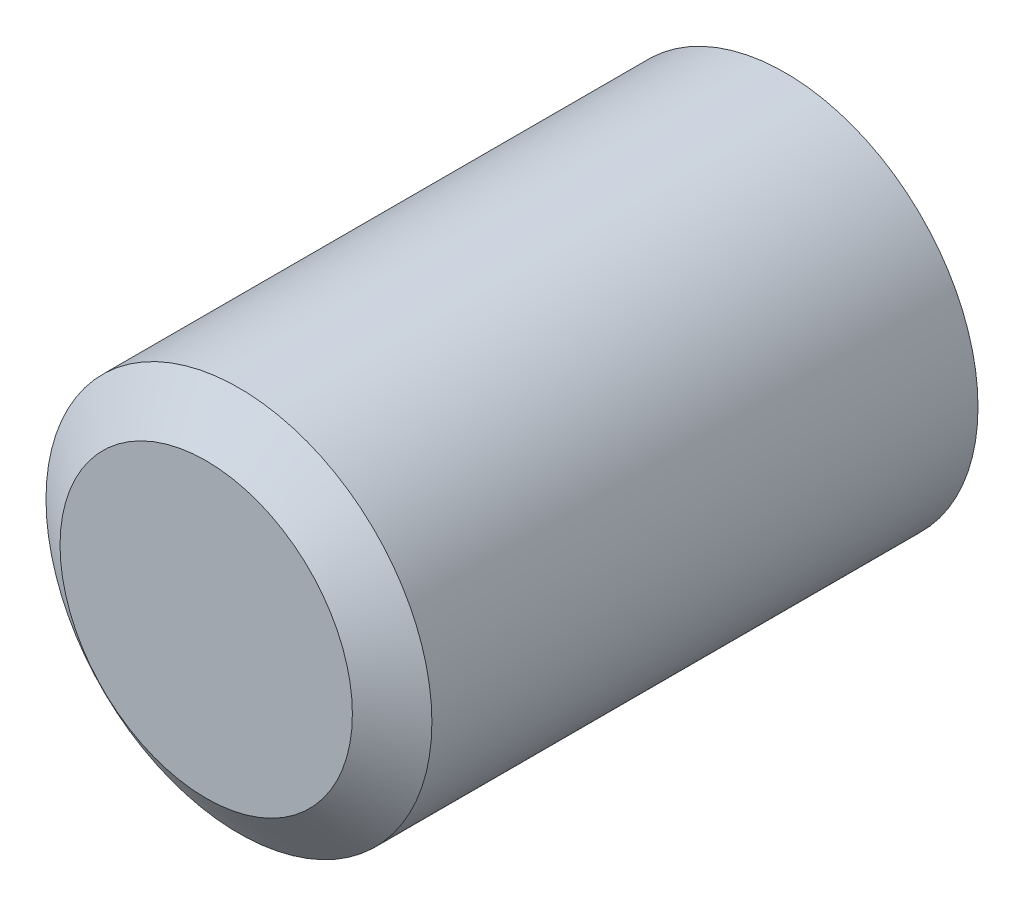
ISO-10303-21;
HEADER;
FILE_DESCRIPTION(('STEP AP214'),'2;1');
FILE_NAME('part.step','',(''),(''),'','','');
FILE_SCHEMA(('AUTOMOTIVE_DESIGN { 1 0 10303 214 1 1 1 1 }'));
ENDSEC;
DATA;
#1=APPLICATION_CONTEXT('core data for automotive mechanical design processes');
#2=APPLICATION_PROTOCOL_DEFINITION('international standard','automotive_design',2000,#1);
#3=PRODUCT_CONTEXT('',#1,'mechanical');
#4=PRODUCT('Part','Part','',(#3));
#5=PRODUCT_RELATED_PRODUCT_CATEGORY('part','',(#4));
#6=PRODUCT_DEFINITION_FORMATION('','',#4);
#7=PRODUCT_DEFINITION_CONTEXT('part definition',#1,'design');
#8=PRODUCT_DEFINITION('design','',#6,#7);
#9=PRODUCT_DEFINITION_SHAPE('','',#8);
#10=(LENGTH_UNIT() NAMED_UNIT(*) SI_UNIT(.MILLI.,.METRE.));
#11=(NAMED_UNIT(*) PLANE_ANGLE_UNIT() SI_UNIT($,.RADIAN.));
#12=(NAMED_UNIT(*) SI_UNIT($,.STERADIAN.) SOLID_ANGLE_UNIT());
#13=UNCERTAINTY_MEASURE_WITH_UNIT(LENGTH_MEASURE(1.E-05),#10,'distance_accuracy_value','');
#14=(GEOMETRIC_REPRESENTATION_CONTEXT(3) GLOBAL_UNCERTAINTY_ASSIGNED_CONTEXT((#13)) GLOBAL_UNIT_ASSIGNED_CONTEXT((#10,
#11,#12)) REPRESENTATION_CONTEXT('',''));
#15=CARTESIAN_POINT('',(0.,0.,0.));
#16=DIRECTION('',(0.,0.,1.));
#17=DIRECTION('',(1.,0.,0.));
#18=AXIS2_PLACEMENT_3D('',#15,#16,#17);
#19=CARTESIAN_POINT('',(0.,0.,9.525));
#20=DIRECTION('',(0.,0.,-1.));
#21=DIRECTION('',(-1.,0.,0.));
#22=AXIS2_PLACEMENT_3D('',#19,#20,#21);
#23=CYLINDRICAL_SURFACE('',#22,3.175);
#24=CARTESIAN_POINT('',(0.,0.,8.98615127117986));
#25=DIRECTION('',(0.,0.,-1.));
#26=DIRECTION('',(-1.,0.,0.));
#27=AXIS2_PLACEMENT_3D('',#24,#25,#26);
#28=CIRCLE('',#27,3.175);
#29=CARTESIAN_POINT('',(-3.175,0.,8.98615127117986));
#30=VERTEX_POINT('',#29);
#31=EDGE_CURVE('E49',#30,#30,#28,.T.);
#32=CARTESIAN_POINT('',(0.,0.,0.));
#33=DIRECTION('',(0.,0.,1.));
#34=DIRECTION('',(1.,0.,0.));
#35=AXIS2_PLACEMENT_3D('',#32,#33,#34);
#36=CIRCLE('',#35,3.175);
#37=CARTESIAN_POINT('',(-3.175,0.,0.));
#38=VERTEX_POINT('',#37);
#39=EDGE_CURVE('E10',#38,#38,#36,.T.);
#40=CARTESIAN_POINT('',(-3.175,0.,8.98615127117986));
#41=CARTESIAN_POINT('',(-3.175,0.,8.89254552877174));
#42=CARTESIAN_POINT('',(-3.175,0.,8.79893978636361));
#43=CARTESIAN_POINT('',(-3.175,0.,8.61172830154737));
#44=CARTESIAN_POINT('',(-3.175,0.,8.51812255913924));
#45=CARTESIAN_POINT('',(-3.175,0.,8.330911074323));
#46=CARTESIAN_POINT('',(-3.175,0.,8.23730533191487));
#47=CARTESIAN_POINT('',(-3.175,0.,8.05009384709862));
#48=CARTESIAN_POINT('',(-3.175,0.,7.9564881046905));
#49=CARTESIAN_POINT('',(-3.175,0.,7.76927661987425));
#50=CARTESIAN_POINT('',(-3.175,0.,7.67567087746613));
#51=CARTESIAN_POINT('',(-3.175,0.,7.48845939264988));
#52=CARTESIAN_POINT('',(-3.175,0.,7.39485365024176));
#53=CARTESIAN_POINT('',(-3.175,0.,7.20764216542551));
#54=CARTESIAN_POINT('',(-3.175,0.,7.11403642301739));
#55=CARTESIAN_POINT('',(-3.175,0.,6.92682493820114));
#56=CARTESIAN_POINT('',(-3.175,0.,6.83321919579302));
#57=CARTESIAN_POINT('',(-3.175,0.,6.64600771097677));
#58=CARTESIAN_POINT('',(-3.175,0.,6.55240196856865));
#59=CARTESIAN_POINT('',(-3.175,0.,6.3651904837524));
#60=CARTESIAN_POINT('',(-3.175,0.,6.27158474134428));
#61=CARTESIAN_POINT('',(-3.175,0.,6.08437325652803));
#62=CARTESIAN_POINT('',(-3.175,0.,5.99076751411991));
#63=CARTESIAN_POINT('',(-3.175,0.,5.80355602930366));
#64=CARTESIAN_POINT('',(-3.175,0.,5.70995028689554));
#65=CARTESIAN_POINT('',(-3.175,0.,5.52273880207929));
#66=CARTESIAN_POINT('',(-3.175,0.,5.42913305967117));
#67=CARTESIAN_POINT('',(-3.175,0.,5.24192157485492));
#68=CARTESIAN_POINT('',(-3.175,0.,5.1483158324468));
#69=CARTESIAN_POINT('',(-3.175,0.,4.96110434763055));
#70=CARTESIAN_POINT('',(-3.175,0.,4.86749860522242));
#71=CARTESIAN_POINT('',(-3.175,0.,4.68028712040618));
#72=CARTESIAN_POINT('',(-3.175,0.,4.58668137799805));
#73=CARTESIAN_POINT('',(-3.175,0.,4.39946989318181));
#74=CARTESIAN_POINT('',(-3.175,0.,4.30586415077368));
#75=CARTESIAN_POINT('',(-3.175,0.,4.11865266595744));
#76=CARTESIAN_POINT('',(-3.175,0.,4.02504692354931));
#77=CARTESIAN_POINT('',(-3.175,0.,3.83783543873307));
#78=CARTESIAN_POINT('',(-3.175,0.,3.74422969632494));
#79=CARTESIAN_POINT('',(-3.175,0.,3.55701821150869));
#80=CARTESIAN_POINT('',(-3.175,0.,3.46341246910057));
#81=CARTESIAN_POINT('',(-3.175,0.,3.27620098428432));
#82=CARTESIAN_POINT('',(-3.175,0.,3.1825952418762));
#83=CARTESIAN_POINT('',(-3.175,0.,2.99538375705995));
#84=CARTESIAN_POINT('',(-3.175,0.,2.90177801465183));
#85=CARTESIAN_POINT('',(-3.175,0.,2.71456652983558));
#86=CARTESIAN_POINT('',(-3.175,0.,2.62096078742746));
#87=CARTESIAN_POINT('',(-3.175,0.,2.43374930261121));
#88=CARTESIAN_POINT('',(-3.175,0.,2.34014356020309));
#89=CARTESIAN_POINT('',(-3.175,0.,2.15293207538684));
#90=CARTESIAN_POINT('',(-3.175,0.,2.05932633297872));
#91=CARTESIAN_POINT('',(-3.175,0.,1.87211484816247));
#92=CARTESIAN_POINT('',(-3.175,0.,1.77850910575435));
#93=CARTESIAN_POINT('',(-3.175,0.,1.5912976209381));
#94=CARTESIAN_POINT('',(-3.175,0.,1.49769187852998));
#95=CARTESIAN_POINT('',(-3.175,0.,1.31048039371373));
#96=CARTESIAN_POINT('',(-3.175,0.,1.21687465130561));
#97=CARTESIAN_POINT('',(-3.175,0.,1.02966316648936));
#98=CARTESIAN_POINT('',(-3.175,0.,0.936057424081235));
#99=CARTESIAN_POINT('',(-3.175,0.,0.748845939264988));
#100=CARTESIAN_POINT('',(-3.175,0.,0.655240196856864));
#101=CARTESIAN_POINT('',(-3.175,0.,0.468028712040617));
#102=CARTESIAN_POINT('',(-3.175,0.,0.374422969632494));
#103=CARTESIAN_POINT('',(-3.175,0.,0.187211484816247));
#104=CARTESIAN_POINT('',(-3.175,0.,0.0936057424081236));
#105=CARTESIAN_POINT('',(-3.175,0.,0.));
#106=B_SPLINE_CURVE_WITH_KNOTS('',3,(#40,#41,#42,#43,#44,#45,#46,#47,#48,#49,#50,#51,#52,#53,
#54,#55,#56,#57,#58,#59,#60,#61,#62,#63,#64,#65,#66,#67,#68,#69,#70,#71,#72,#73,#74,#75,#76,#77,
#78,#79,#80,#81,#82,#83,#84,#85,#86,#87,#88,#89,#90,#91,#92,#93,#94,#95,#96,#97,#98,#99,#100,
#101,#102,#103,#104,#105),.UNSPECIFIED.,.F.,.F.,(4,2,2,2,2,2,2,2,2,2,2,2,2,2,2,2,2,2,2,2,2,2,2,
2,2,2,2,2,2,2,2,2,4),(0.,0.28081722722437,0.561634454448741,0.842451681673111,1.12326890889748,
1.40408613612185,1.68490336334622,1.96572059057059,2.24653781779496,2.52735504501933,
2.80817227224371,3.08898949946808,3.36980672669245,3.65062395391682,3.93144118114119,
4.21225840836556,4.49307563558993,4.7738928628143,5.05471009003867,5.33552731726304,
5.61634454448741,5.89716177171178,6.17797899893615,6.45879622616052,6.73961345338489,
7.02043068060926,7.30124790783363,7.58206513505801,7.86288236228238,8.14369958950675,
8.42451681673112,8.70533404395549,8.98615127117986),.UNSPECIFIED.);
#107=EDGE_CURVE('BSEAM37',#30,#38,#106,.T.);
#108=ORIENTED_EDGE('',*,*,#31,.T.);
#109=ORIENTED_EDGE('',*,*,#39,.T.);
#110=ORIENTED_EDGE('',*,*,#107,.T.);
#111=ORIENTED_EDGE('',*,*,#107,.F.);
#112=EDGE_LOOP('',(#108,#110,#109,#111));
#113=FACE_BOUND('',#112,.T.);
#114=ADVANCED_FACE('F37',(#113),#23,.T.);
#115=CARTESIAN_POINT('',(0.,0.,0.));
#116=DIRECTION('',(0.,0.,1.));
#117=DIRECTION('',(1.,0.,0.));
#118=AXIS2_PLACEMENT_3D('',#115,#116,#117);
#119=PLANE('',#118);
#120=ORIENTED_EDGE('',*,*,#39,.F.);
#121=EDGE_LOOP('',(#120));
#122=FACE_BOUND('',#121,.T.);
#123=ADVANCED_FACE('F61',(#122),#119,.F.);
#124=CARTESIAN_POINT('',(0.,0.,9.525));
#125=DIRECTION('',(0.,0.,-1.));
#126=DIRECTION('',(-1.,0.,0.));
#127=AXIS2_PLACEMENT_3D('',#124,#125,#126);
#128=CONICAL_SURFACE('',#127,2.405444262,0.959931088596877);
#129=ORIENTED_EDGE('',*,*,#31,.F.);
#130=EDGE_LOOP('',(#129));
#131=FACE_BOUND('',#130,.T.);
#132=CARTESIAN_POINT('',(0.,0.,9.525));
#133=DIRECTION('',(0.,0.,-1.));
#134=DIRECTION('',(-1.,0.,0.));
#135=AXIS2_PLACEMENT_3D('',#132,#133,#134);
#136=CIRCLE('',#135,2.405444262);
#137=CARTESIAN_POINT('',(-2.405444262,0.,9.525));
#138=VERTEX_POINT('',#137);
#139=EDGE_CURVE('E44',#138,#138,#136,.T.);
#140=ORIENTED_EDGE('',*,*,#139,.T.);
#141=EDGE_LOOP('',(#140));
#142=FACE_BOUND('',#141,.T.);
#143=ADVANCED_FACE('F58',(#131,#142),#128,.T.);
#144=CARTESIAN_POINT('',(0.,0.,9.525));
#145=DIRECTION('',(0.,0.,1.));
#146=DIRECTION('',(1.,0.,0.));
#147=AXIS2_PLACEMENT_3D('',#144,#145,#146);
#148=PLANE('',#147);
#149=ORIENTED_EDGE('',*,*,#139,.F.);
#150=EDGE_LOOP('',(#149));
#151=FACE_BOUND('',#150,.T.);
#152=ADVANCED_FACE('F60',(#151),#148,.T.);
#153=CLOSED_SHELL('',(#114,#123,#143,#152));
#154=MANIFOLD_SOLID_BREP('B2',#153);
#155=ADVANCED_BREP_SHAPE_REPRESENTATION('',(#18,#154),#14);
#156=SHAPE_DEFINITION_REPRESENTATION(#9,#155);
ENDSEC;
END-ISO-10303-21;
